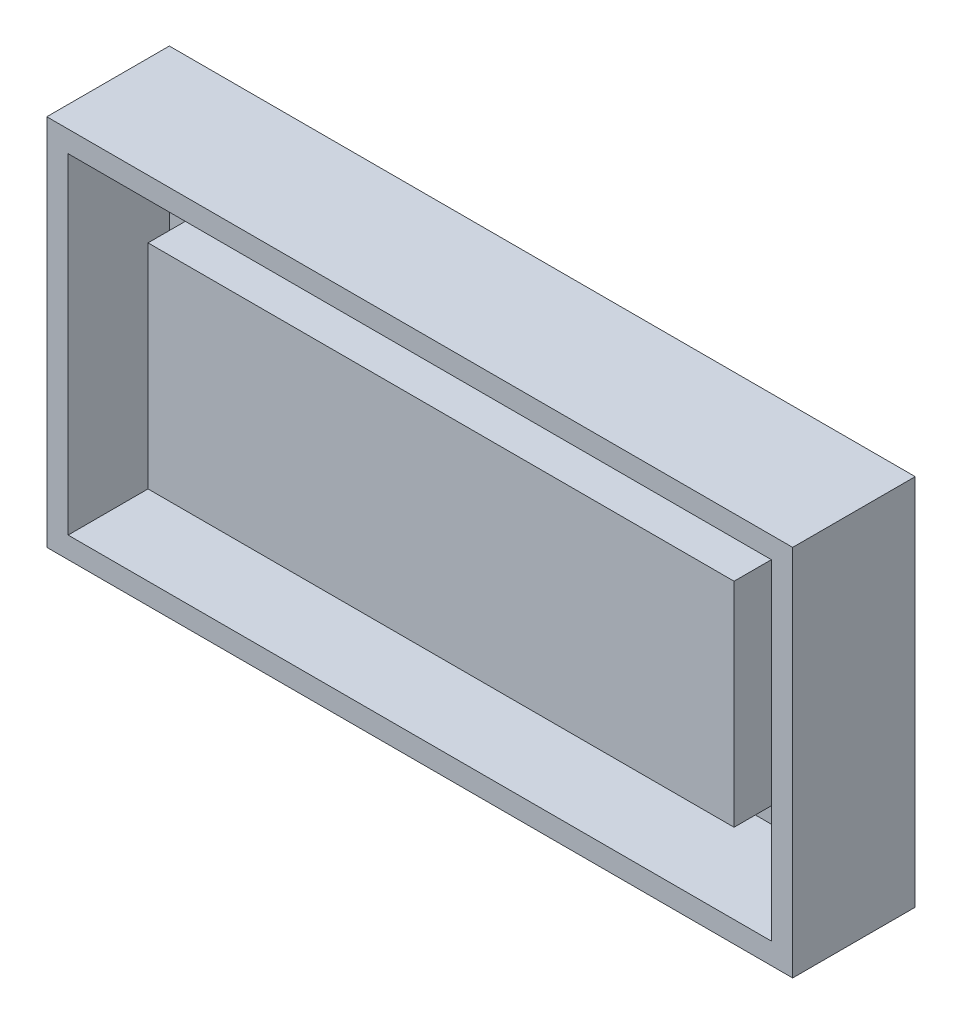
ISO-10303-21;
HEADER;
FILE_DESCRIPTION(('STEP AP214'),'2;1');
FILE_NAME('part.step','',(''),(''),'','','');
FILE_SCHEMA(('AUTOMOTIVE_DESIGN { 1 0 10303 214 1 1 1 1 }'));
ENDSEC;
DATA;
#1=APPLICATION_CONTEXT('core data for automotive mechanical design processes');
#2=APPLICATION_PROTOCOL_DEFINITION('international standard','automotive_design',2000,#1);
#3=PRODUCT_CONTEXT('',#1,'mechanical');
#4=PRODUCT('Part','Part','',(#3));
#5=PRODUCT_RELATED_PRODUCT_CATEGORY('part','',(#4));
#6=PRODUCT_DEFINITION_FORMATION('','',#4);
#7=PRODUCT_DEFINITION_CONTEXT('part definition',#1,'design');
#8=PRODUCT_DEFINITION('design','',#6,#7);
#9=PRODUCT_DEFINITION_SHAPE('','',#8);
#10=(LENGTH_UNIT() NAMED_UNIT(*) SI_UNIT(.MILLI.,.METRE.));
#11=(NAMED_UNIT(*) PLANE_ANGLE_UNIT() SI_UNIT($,.RADIAN.));
#12=(NAMED_UNIT(*) SI_UNIT($,.STERADIAN.) SOLID_ANGLE_UNIT());
#13=UNCERTAINTY_MEASURE_WITH_UNIT(LENGTH_MEASURE(1.E-05),#10,'distance_accuracy_value','');
#14=(GEOMETRIC_REPRESENTATION_CONTEXT(3) GLOBAL_UNCERTAINTY_ASSIGNED_CONTEXT((#13)) GLOBAL_UNIT_ASSIGNED_CONTEXT((#10,
#11,#12)) REPRESENTATION_CONTEXT('',''));
#15=CARTESIAN_POINT('',(0.,0.,0.));
#16=DIRECTION('',(0.,0.,1.));
#17=DIRECTION('',(1.,0.,0.));
#18=AXIS2_PLACEMENT_3D('',#15,#16,#17);
#19=CARTESIAN_POINT('',(34.9999999999999,17.4999999999999,-2.));
#20=DIRECTION('',(-1.,0.,0.));
#21=DIRECTION('',(0.,0.,1.));
#22=AXIS2_PLACEMENT_3D('',#19,#20,#21);
#23=PLANE('',#22);
#24=DIRECTION('',(0.,0.,1.));
#25=VECTOR('',#24,1.);
#26=CARTESIAN_POINT('',(34.9999999999999,17.4999999999999,-2.));
#27=LINE('',#26,#25);
#28=CARTESIAN_POINT('',(34.9999999999999,17.4999999999999,-2.));
#29=VERTEX_POINT('',#28);
#30=CARTESIAN_POINT('',(34.9999999999999,17.4999999999999,9.5));
#31=VERTEX_POINT('',#30);
#32=EDGE_CURVE('E222',#29,#31,#27,.T.);
#33=ORIENTED_EDGE('',*,*,#32,.T.);
#34=DIRECTION('',(0.,-1.,0.));
#35=VECTOR('',#34,1.);
#36=CARTESIAN_POINT('',(34.9999999999999,0.,9.5));
#37=LINE('',#36,#35);
#38=CARTESIAN_POINT('',(34.9999999999999,-17.5,9.5));
#39=VERTEX_POINT('',#38);
#40=EDGE_CURVE('E181',#31,#39,#37,.T.);
#41=ORIENTED_EDGE('',*,*,#40,.T.);
#42=DIRECTION('',(0.,0.,1.));
#43=VECTOR('',#42,1.);
#44=CARTESIAN_POINT('',(34.9999999999999,-17.5,-2.));
#45=LINE('',#44,#43);
#46=CARTESIAN_POINT('',(34.9999999999999,-17.5,-2.));
#47=VERTEX_POINT('',#46);
#48=EDGE_CURVE('E11',#47,#39,#45,.T.);
#49=ORIENTED_EDGE('',*,*,#48,.F.);
#50=DIRECTION('',(0.,-1.,0.));
#51=VECTOR('',#50,1.);
#52=CARTESIAN_POINT('',(34.9999999999999,17.4999999999999,-2.));
#53=LINE('',#52,#51);
#54=EDGE_CURVE('E211',#29,#47,#53,.T.);
#55=ORIENTED_EDGE('',*,*,#54,.F.);
#56=EDGE_LOOP('',(#33,#41,#49,#55));
#57=FACE_BOUND('',#56,.T.);
#58=ADVANCED_FACE('F43',(#57),#23,.F.);
#59=CARTESIAN_POINT('',(34.9999999999999,-17.5,-2.));
#60=DIRECTION('',(0.,1.,0.));
#61=DIRECTION('',(-1.,0.,0.));
#62=AXIS2_PLACEMENT_3D('',#59,#60,#61);
#63=PLANE('',#62);
#64=ORIENTED_EDGE('',*,*,#48,.T.);
#65=DIRECTION('',(-1.,0.,0.));
#66=VECTOR('',#65,1.);
#67=CARTESIAN_POINT('',(0.,-17.5,9.5));
#68=LINE('',#67,#66);
#69=CARTESIAN_POINT('',(-34.9999999999999,-17.5,9.5));
#70=VERTEX_POINT('',#69);
#71=EDGE_CURVE('E178',#39,#70,#68,.T.);
#72=ORIENTED_EDGE('',*,*,#71,.T.);
#73=DIRECTION('',(0.,0.,1.));
#74=VECTOR('',#73,1.);
#75=CARTESIAN_POINT('',(-34.9999999999999,-17.5,-2.));
#76=LINE('',#75,#74);
#77=CARTESIAN_POINT('',(-34.9999999999999,-17.5,-2.));
#78=VERTEX_POINT('',#77);
#79=EDGE_CURVE('E50',#78,#70,#76,.T.);
#80=ORIENTED_EDGE('',*,*,#79,.F.);
#81=DIRECTION('',(-1.,0.,0.));
#82=VECTOR('',#81,1.);
#83=CARTESIAN_POINT('',(34.9999999999999,-17.5,-2.));
#84=LINE('',#83,#82);
#85=EDGE_CURVE('E214',#47,#78,#84,.T.);
#86=ORIENTED_EDGE('',*,*,#85,.F.);
#87=EDGE_LOOP('',(#64,#72,#80,#86));
#88=FACE_BOUND('',#87,.T.);
#89=ADVANCED_FACE('F237',(#88),#63,.F.);
#90=CARTESIAN_POINT('',(-34.9999999999999,17.4999999999999,-2.));
#91=DIRECTION('',(-1.,0.,0.));
#92=DIRECTION('',(0.,0.,1.));
#93=AXIS2_PLACEMENT_3D('',#90,#91,#92);
#94=PLANE('',#93);
#95=ORIENTED_EDGE('',*,*,#79,.T.);
#96=DIRECTION('',(0.,-1.,0.));
#97=VECTOR('',#96,1.);
#98=CARTESIAN_POINT('',(-34.9999999999999,0.,9.5));
#99=LINE('',#98,#97);
#100=CARTESIAN_POINT('',(-34.9999999999999,17.4999999999999,9.5));
#101=VERTEX_POINT('',#100);
#102=EDGE_CURVE('E174',#101,#70,#99,.T.);
#103=ORIENTED_EDGE('',*,*,#102,.F.);
#104=DIRECTION('',(0.,0.,1.));
#105=VECTOR('',#104,1.);
#106=CARTESIAN_POINT('',(-34.9999999999999,17.4999999999999,-2.));
#107=LINE('',#106,#105);
#108=CARTESIAN_POINT('',(-34.9999999999999,17.4999999999999,-2.));
#109=VERTEX_POINT('',#108);
#110=EDGE_CURVE('E224',#109,#101,#107,.T.);
#111=ORIENTED_EDGE('',*,*,#110,.F.);
#112=DIRECTION('',(0.,-1.,0.));
#113=VECTOR('',#112,1.);
#114=CARTESIAN_POINT('',(-34.9999999999999,17.4999999999999,-2.));
#115=LINE('',#114,#113);
#116=EDGE_CURVE('E216',#109,#78,#115,.T.);
#117=ORIENTED_EDGE('',*,*,#116,.T.);
#118=EDGE_LOOP('',(#95,#103,#111,#117));
#119=FACE_BOUND('',#118,.T.);
#120=ADVANCED_FACE('F228',(#119),#94,.T.);
#121=CARTESIAN_POINT('',(34.9999999999999,17.4999999999999,-2.));
#122=DIRECTION('',(0.,1.,0.));
#123=DIRECTION('',(0.,0.,1.));
#124=AXIS2_PLACEMENT_3D('',#121,#122,#123);
#125=PLANE('',#124);
#126=ORIENTED_EDGE('',*,*,#110,.T.);
#127=DIRECTION('',(-1.,0.,0.));
#128=VECTOR('',#127,1.);
#129=CARTESIAN_POINT('',(0.,17.4999999999999,9.5));
#130=LINE('',#129,#128);
#131=EDGE_CURVE('E171',#31,#101,#130,.T.);
#132=ORIENTED_EDGE('',*,*,#131,.F.);
#133=ORIENTED_EDGE('',*,*,#32,.F.);
#134=DIRECTION('',(-1.,0.,0.));
#135=VECTOR('',#134,1.);
#136=CARTESIAN_POINT('',(34.9999999999999,17.4999999999999,-2.));
#137=LINE('',#136,#135);
#138=EDGE_CURVE('E219',#29,#109,#137,.T.);
#139=ORIENTED_EDGE('',*,*,#138,.T.);
#140=EDGE_LOOP('',(#126,#132,#133,#139));
#141=FACE_BOUND('',#140,.T.);
#142=ADVANCED_FACE('F243',(#141),#125,.T.);
#143=CARTESIAN_POINT('',(0.,0.,-2.));
#144=DIRECTION('',(0.,0.,-1.));
#145=DIRECTION('',(-1.,0.,0.));
#146=AXIS2_PLACEMENT_3D('',#143,#144,#145);
#147=PLANE('',#146);
#148=ORIENTED_EDGE('',*,*,#54,.T.);
#149=ORIENTED_EDGE('',*,*,#85,.T.);
#150=ORIENTED_EDGE('',*,*,#116,.F.);
#151=ORIENTED_EDGE('',*,*,#138,.F.);
#152=EDGE_LOOP('',(#148,#149,#150,#151));
#153=FACE_BOUND('',#152,.T.);
#154=ADVANCED_FACE('F245',(#153),#147,.T.);
#155=CARTESIAN_POINT('',(0.,15.5,9.5));
#156=DIRECTION('',(0.,-1.,0.));
#157=DIRECTION('',(0.,0.,-1.));
#158=AXIS2_PLACEMENT_3D('',#155,#156,#157);
#159=PLANE('',#158);
#160=DIRECTION('',(-1.,0.,0.));
#161=VECTOR('',#160,1.);
#162=CARTESIAN_POINT('',(0.,15.5,0.));
#163=LINE('',#162,#161);
#164=CARTESIAN_POINT('',(32.9999999999999,15.5,0.));
#165=VERTEX_POINT('',#164);
#166=CARTESIAN_POINT('',(-32.9999999999999,15.5,0.));
#167=VERTEX_POINT('',#166);
#168=EDGE_CURVE('E167',#165,#167,#163,.T.);
#169=ORIENTED_EDGE('',*,*,#168,.F.);
#170=DIRECTION('',(0.,0.,-1.));
#171=VECTOR('',#170,1.);
#172=CARTESIAN_POINT('',(32.9999999999999,15.5,9.5));
#173=LINE('',#172,#171);
#174=CARTESIAN_POINT('',(32.9999999999999,15.5,9.5));
#175=VERTEX_POINT('',#174);
#176=EDGE_CURVE('E209',#175,#165,#173,.T.);
#177=ORIENTED_EDGE('',*,*,#176,.F.);
#178=DIRECTION('',(-1.,0.,0.));
#179=VECTOR('',#178,1.);
#180=CARTESIAN_POINT('',(0.,15.5,9.5));
#181=LINE('',#180,#179);
#182=CARTESIAN_POINT('',(-32.9999999999999,15.5,9.5));
#183=VERTEX_POINT('',#182);
#184=EDGE_CURVE('E184',#175,#183,#181,.T.);
#185=ORIENTED_EDGE('',*,*,#184,.T.);
#186=DIRECTION('',(0.,0.,-1.));
#187=VECTOR('',#186,1.);
#188=CARTESIAN_POINT('',(-32.9999999999999,15.5,9.5));
#189=LINE('',#188,#187);
#190=EDGE_CURVE('E195',#183,#167,#189,.T.);
#191=ORIENTED_EDGE('',*,*,#190,.T.);
#192=EDGE_LOOP('',(#169,#177,#185,#191));
#193=FACE_BOUND('',#192,.T.);
#194=ADVANCED_FACE('F247',(#193),#159,.T.);
#195=CARTESIAN_POINT('',(32.9999999999999,0.,9.5));
#196=DIRECTION('',(1.,0.,0.));
#197=DIRECTION('',(0.,0.,-1.));
#198=AXIS2_PLACEMENT_3D('',#195,#196,#197);
#199=PLANE('',#198);
#200=DIRECTION('',(0.,-1.,0.));
#201=VECTOR('',#200,1.);
#202=CARTESIAN_POINT('',(32.9999999999999,0.,0.));
#203=LINE('',#202,#201);
#204=CARTESIAN_POINT('',(32.9999999999999,-15.5,0.));
#205=VERTEX_POINT('',#204);
#206=EDGE_CURVE('E198',#165,#205,#203,.T.);
#207=ORIENTED_EDGE('',*,*,#206,.T.);
#208=DIRECTION('',(0.,0.,-1.));
#209=VECTOR('',#208,1.);
#210=CARTESIAN_POINT('',(32.9999999999999,-15.5,9.5));
#211=LINE('',#210,#209);
#212=CARTESIAN_POINT('',(32.9999999999999,-15.5,9.5));
#213=VERTEX_POINT('',#212);
#214=EDGE_CURVE('E207',#213,#205,#211,.T.);
#215=ORIENTED_EDGE('',*,*,#214,.F.);
#216=DIRECTION('',(0.,-1.,0.));
#217=VECTOR('',#216,1.);
#218=CARTESIAN_POINT('',(32.9999999999999,0.,9.5));
#219=LINE('',#218,#217);
#220=EDGE_CURVE('E187',#175,#213,#219,.T.);
#221=ORIENTED_EDGE('',*,*,#220,.F.);
#222=ORIENTED_EDGE('',*,*,#176,.T.);
#223=EDGE_LOOP('',(#207,#215,#221,#222));
#224=FACE_BOUND('',#223,.T.);
#225=ADVANCED_FACE('F253',(#224),#199,.F.);
#226=CARTESIAN_POINT('',(0.,-15.5,9.5));
#227=DIRECTION('',(0.,-1.,0.));
#228=DIRECTION('',(0.,0.,-1.));
#229=AXIS2_PLACEMENT_3D('',#226,#227,#228);
#230=PLANE('',#229);
#231=DIRECTION('',(-1.,0.,0.));
#232=VECTOR('',#231,1.);
#233=CARTESIAN_POINT('',(0.,-15.5,0.));
#234=LINE('',#233,#232);
#235=CARTESIAN_POINT('',(-32.9999999999999,-15.5,0.));
#236=VERTEX_POINT('',#235);
#237=EDGE_CURVE('E65',#205,#236,#234,.T.);
#238=ORIENTED_EDGE('',*,*,#237,.T.);
#239=DIRECTION('',(0.,0.,-1.));
#240=VECTOR('',#239,1.);
#241=CARTESIAN_POINT('',(-32.9999999999999,-15.5,9.5));
#242=LINE('',#241,#240);
#243=CARTESIAN_POINT('',(-32.9999999999999,-15.5,9.5));
#244=VERTEX_POINT('',#243);
#245=EDGE_CURVE('E205',#244,#236,#242,.T.);
#246=ORIENTED_EDGE('',*,*,#245,.F.);
#247=DIRECTION('',(-1.,0.,0.));
#248=VECTOR('',#247,1.);
#249=CARTESIAN_POINT('',(0.,-15.5,9.5));
#250=LINE('',#249,#248);
#251=EDGE_CURVE('E190',#213,#244,#250,.T.);
#252=ORIENTED_EDGE('',*,*,#251,.F.);
#253=ORIENTED_EDGE('',*,*,#214,.T.);
#254=EDGE_LOOP('',(#238,#246,#252,#253));
#255=FACE_BOUND('',#254,.T.);
#256=ADVANCED_FACE('F288',(#255),#230,.F.);
#257=CARTESIAN_POINT('',(-32.9999999999999,0.,9.5));
#258=DIRECTION('',(1.,0.,0.));
#259=DIRECTION('',(0.,1.,0.));
#260=AXIS2_PLACEMENT_3D('',#257,#258,#259);
#261=PLANE('',#260);
#262=DIRECTION('',(0.,-1.,0.));
#263=VECTOR('',#262,1.);
#264=CARTESIAN_POINT('',(-32.9999999999999,0.,0.));
#265=LINE('',#264,#263);
#266=EDGE_CURVE('E175',#167,#236,#265,.T.);
#267=ORIENTED_EDGE('',*,*,#266,.F.);
#268=ORIENTED_EDGE('',*,*,#190,.F.);
#269=DIRECTION('',(0.,-1.,0.));
#270=VECTOR('',#269,1.);
#271=CARTESIAN_POINT('',(-32.9999999999999,0.,9.5));
#272=LINE('',#271,#270);
#273=EDGE_CURVE('E192',#183,#244,#272,.T.);
#274=ORIENTED_EDGE('',*,*,#273,.T.);
#275=ORIENTED_EDGE('',*,*,#245,.T.);
#276=EDGE_LOOP('',(#267,#268,#274,#275));
#277=FACE_BOUND('',#276,.T.);
#278=ADVANCED_FACE('F275',(#277),#261,.T.);
#279=CARTESIAN_POINT('',(0.,0.,9.5));
#280=DIRECTION('',(0.,0.,1.));
#281=DIRECTION('',(1.,0.,0.));
#282=AXIS2_PLACEMENT_3D('',#279,#280,#281);
#283=PLANE('',#282);
#284=ORIENTED_EDGE('',*,*,#131,.T.);
#285=ORIENTED_EDGE('',*,*,#102,.T.);
#286=ORIENTED_EDGE('',*,*,#71,.F.);
#287=ORIENTED_EDGE('',*,*,#40,.F.);
#288=EDGE_LOOP('',(#284,#285,#286,#287));
#289=FACE_BOUND('',#288,.T.);
#290=ORIENTED_EDGE('',*,*,#184,.F.);
#291=ORIENTED_EDGE('',*,*,#220,.T.);
#292=ORIENTED_EDGE('',*,*,#251,.T.);
#293=ORIENTED_EDGE('',*,*,#273,.F.);
#294=EDGE_LOOP('',(#290,#291,#292,#293));
#295=FACE_BOUND('',#294,.T.);
#296=ADVANCED_FACE('F233',(#289,#295),#283,.T.);
#297=CARTESIAN_POINT('',(0.,0.,0.));
#298=DIRECTION('',(0.,0.,-1.));
#299=DIRECTION('',(-1.,0.,0.));
#300=AXIS2_PLACEMENT_3D('',#297,#298,#299);
#301=PLANE('',#300);
#302=DIRECTION('',(0.,1.,0.));
#303=VECTOR('',#302,1.);
#304=CARTESIAN_POINT('',(27.5,-10.,0.));
#305=LINE('',#304,#303);
#306=CARTESIAN_POINT('',(27.5,-10.,0.));
#307=VERTEX_POINT('',#306);
#308=CARTESIAN_POINT('',(27.5,10.,0.));
#309=VERTEX_POINT('',#308);
#310=EDGE_CURVE('E156',#307,#309,#305,.T.);
#311=ORIENTED_EDGE('',*,*,#310,.F.);
#312=DIRECTION('',(-1.,0.,0.));
#313=VECTOR('',#312,1.);
#314=CARTESIAN_POINT('',(27.5,-10.,0.));
#315=LINE('',#314,#313);
#316=CARTESIAN_POINT('',(-27.5,-10.,0.));
#317=VERTEX_POINT('',#316);
#318=EDGE_CURVE('E162',#307,#317,#315,.T.);
#319=ORIENTED_EDGE('',*,*,#318,.T.);
#320=DIRECTION('',(0.,1.,0.));
#321=VECTOR('',#320,1.);
#322=CARTESIAN_POINT('',(-27.5,-10.,0.));
#323=LINE('',#322,#321);
#324=CARTESIAN_POINT('',(-27.5,10.,0.));
#325=VERTEX_POINT('',#324);
#326=EDGE_CURVE('E138',#317,#325,#323,.T.);
#327=ORIENTED_EDGE('',*,*,#326,.T.);
#328=DIRECTION('',(-1.,0.,0.));
#329=VECTOR('',#328,1.);
#330=CARTESIAN_POINT('',(27.5,10.,0.));
#331=LINE('',#330,#329);
#332=EDGE_CURVE('E57',#309,#325,#331,.T.);
#333=ORIENTED_EDGE('',*,*,#332,.F.);
#334=EDGE_LOOP('',(#311,#319,#327,#333));
#335=FACE_BOUND('',#334,.T.);
#336=ORIENTED_EDGE('',*,*,#206,.F.);
#337=ORIENTED_EDGE('',*,*,#168,.T.);
#338=ORIENTED_EDGE('',*,*,#266,.T.);
#339=ORIENTED_EDGE('',*,*,#237,.F.);
#340=EDGE_LOOP('',(#336,#337,#338,#339));
#341=FACE_BOUND('',#340,.T.);
#342=ADVANCED_FACE('F266',(#335,#341),#301,.F.);
#343=CARTESIAN_POINT('',(27.5,-10.,7.5));
#344=DIRECTION('',(0.,-1.,0.));
#345=DIRECTION('',(0.,0.,-1.));
#346=AXIS2_PLACEMENT_3D('',#343,#344,#345);
#347=PLANE('',#346);
#348=ORIENTED_EDGE('',*,*,#318,.F.);
#349=DIRECTION('',(0.,0.,-1.));
#350=VECTOR('',#349,1.);
#351=CARTESIAN_POINT('',(27.5,-10.,7.5));
#352=LINE('',#351,#350);
#353=CARTESIAN_POINT('',(27.5,-10.,7.5));
#354=VERTEX_POINT('',#353);
#355=EDGE_CURVE('E154',#354,#307,#352,.T.);
#356=ORIENTED_EDGE('',*,*,#355,.F.);
#357=DIRECTION('',(-1.,0.,0.));
#358=VECTOR('',#357,1.);
#359=CARTESIAN_POINT('',(27.5,-10.,7.5));
#360=LINE('',#359,#358);
#361=CARTESIAN_POINT('',(-27.5,-10.,7.5));
#362=VERTEX_POINT('',#361);
#363=EDGE_CURVE('E149',#354,#362,#360,.T.);
#364=ORIENTED_EDGE('',*,*,#363,.T.);
#365=DIRECTION('',(0.,0.,-1.));
#366=VECTOR('',#365,1.);
#367=CARTESIAN_POINT('',(-27.5,-10.,7.5));
#368=LINE('',#367,#366);
#369=EDGE_CURVE('E133',#362,#317,#368,.T.);
#370=ORIENTED_EDGE('',*,*,#369,.T.);
#371=EDGE_LOOP('',(#348,#356,#364,#370));
#372=FACE_BOUND('',#371,.T.);
#373=ADVANCED_FACE('F153',(#372),#347,.T.);
#374=CARTESIAN_POINT('',(27.5,-10.,7.5));
#375=DIRECTION('',(-1.,0.,0.));
#376=DIRECTION('',(0.,0.,1.));
#377=AXIS2_PLACEMENT_3D('',#374,#375,#376);
#378=PLANE('',#377);
#379=ORIENTED_EDGE('',*,*,#310,.T.);
#380=DIRECTION('',(0.,0.,-1.));
#381=VECTOR('',#380,1.);
#382=CARTESIAN_POINT('',(27.5,10.,7.5));
#383=LINE('',#382,#381);
#384=CARTESIAN_POINT('',(27.5,10.,7.5));
#385=VERTEX_POINT('',#384);
#386=EDGE_CURVE('E168',#385,#309,#383,.T.);
#387=ORIENTED_EDGE('',*,*,#386,.F.);
#388=DIRECTION('',(0.,1.,0.));
#389=VECTOR('',#388,1.);
#390=CARTESIAN_POINT('',(27.5,-10.,7.5));
#391=LINE('',#390,#389);
#392=EDGE_CURVE('E144',#354,#385,#391,.T.);
#393=ORIENTED_EDGE('',*,*,#392,.F.);
#394=ORIENTED_EDGE('',*,*,#355,.T.);
#395=EDGE_LOOP('',(#379,#387,#393,#394));
#396=FACE_BOUND('',#395,.T.);
#397=ADVANCED_FACE('F273',(#396),#378,.F.);
#398=CARTESIAN_POINT('',(27.5,10.,7.5));
#399=DIRECTION('',(0.,-1.,0.));
#400=DIRECTION('',(0.,0.,-1.));
#401=AXIS2_PLACEMENT_3D('',#398,#399,#400);
#402=PLANE('',#401);
#403=ORIENTED_EDGE('',*,*,#332,.T.);
#404=DIRECTION('',(0.,0.,-1.));
#405=VECTOR('',#404,1.);
#406=CARTESIAN_POINT('',(-27.5,10.,7.5));
#407=LINE('',#406,#405);
#408=CARTESIAN_POINT('',(-27.5,10.,7.5));
#409=VERTEX_POINT('',#408);
#410=EDGE_CURVE('E143',#409,#325,#407,.T.);
#411=ORIENTED_EDGE('',*,*,#410,.F.);
#412=DIRECTION('',(-1.,0.,0.));
#413=VECTOR('',#412,1.);
#414=CARTESIAN_POINT('',(27.5,10.,7.5));
#415=LINE('',#414,#413);
#416=EDGE_CURVE('E151',#385,#409,#415,.T.);
#417=ORIENTED_EDGE('',*,*,#416,.F.);
#418=ORIENTED_EDGE('',*,*,#386,.T.);
#419=EDGE_LOOP('',(#403,#411,#417,#418));
#420=FACE_BOUND('',#419,.T.);
#421=ADVANCED_FACE('F300',(#420),#402,.F.);
#422=CARTESIAN_POINT('',(-27.5,-10.,7.5));
#423=DIRECTION('',(-1.,0.,0.));
#424=DIRECTION('',(0.,0.,1.));
#425=AXIS2_PLACEMENT_3D('',#422,#423,#424);
#426=PLANE('',#425);
#427=ORIENTED_EDGE('',*,*,#326,.F.);
#428=ORIENTED_EDGE('',*,*,#369,.F.);
#429=DIRECTION('',(0.,1.,0.));
#430=VECTOR('',#429,1.);
#431=CARTESIAN_POINT('',(-27.5,-10.,7.5));
#432=LINE('',#431,#430);
#433=EDGE_CURVE('E136',#362,#409,#432,.T.);
#434=ORIENTED_EDGE('',*,*,#433,.T.);
#435=ORIENTED_EDGE('',*,*,#410,.T.);
#436=EDGE_LOOP('',(#427,#428,#434,#435));
#437=FACE_BOUND('',#436,.T.);
#438=ADVANCED_FACE('F135',(#437),#426,.T.);
#439=CARTESIAN_POINT('',(0.,0.,7.5));
#440=DIRECTION('',(0.,0.,-1.));
#441=DIRECTION('',(-1.,0.,0.));
#442=AXIS2_PLACEMENT_3D('',#439,#440,#441);
#443=PLANE('',#442);
#444=ORIENTED_EDGE('',*,*,#363,.F.);
#445=ORIENTED_EDGE('',*,*,#392,.T.);
#446=ORIENTED_EDGE('',*,*,#416,.T.);
#447=ORIENTED_EDGE('',*,*,#433,.F.);
#448=EDGE_LOOP('',(#444,#445,#446,#447));
#449=FACE_BOUND('',#448,.T.);
#450=ADVANCED_FACE('F148',(#449),#443,.F.);
#451=CLOSED_SHELL('',(#58,#89,#120,#142,#154,#194,#225,#256,#278,#296,#342,#373,#397,#421,#438,#450));
#452=MANIFOLD_SOLID_BREP('B2',#451);
#453=ADVANCED_BREP_SHAPE_REPRESENTATION('',(#18,#452),#14);
#454=SHAPE_DEFINITION_REPRESENTATION(#9,#453);
ENDSEC;
END-ISO-10303-21;
